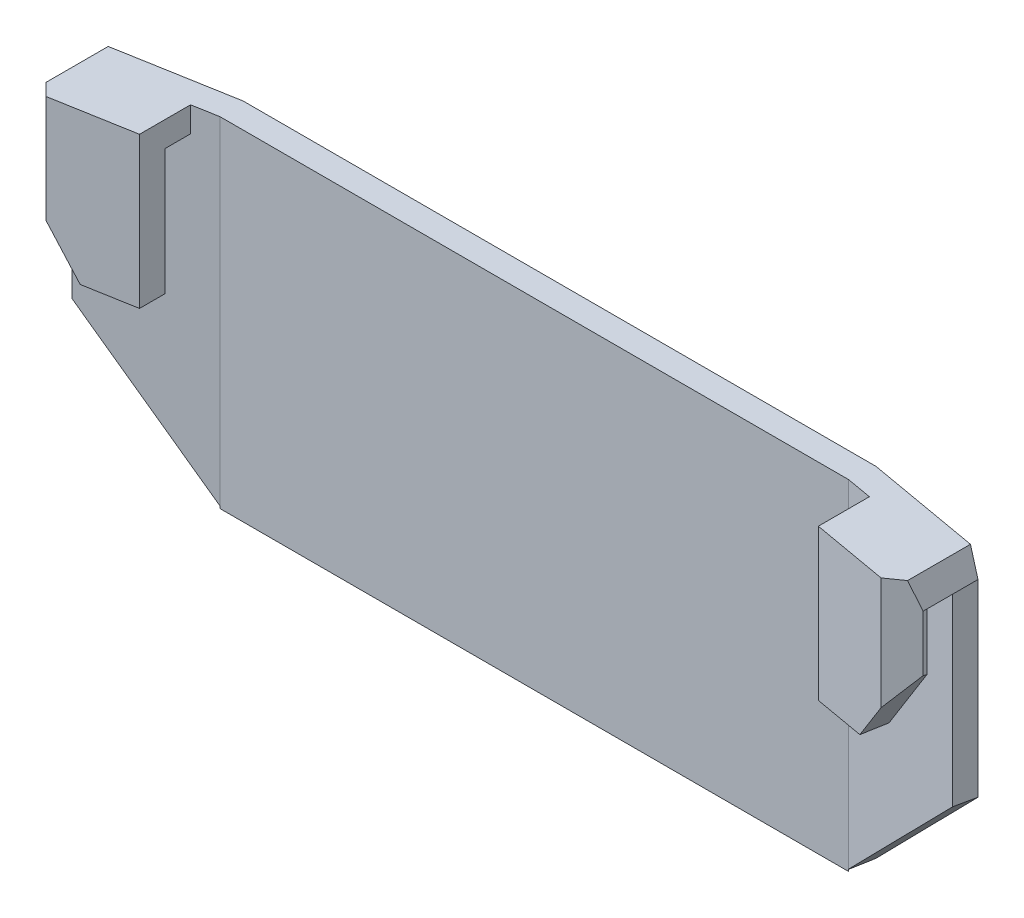
ISO-10303-21;
HEADER;
FILE_DESCRIPTION(('STEP AP214'),'2;1');
FILE_NAME('part.step','',(''),(''),'','','');
FILE_SCHEMA(('AUTOMOTIVE_DESIGN { 1 0 10303 214 1 1 1 1 }'));
ENDSEC;
DATA;
#1=APPLICATION_CONTEXT('core data for automotive mechanical design processes');
#2=APPLICATION_PROTOCOL_DEFINITION('international standard','automotive_design',2000,#1);
#3=PRODUCT_CONTEXT('',#1,'mechanical');
#4=PRODUCT('Part','Part','',(#3));
#5=PRODUCT_RELATED_PRODUCT_CATEGORY('part','',(#4));
#6=PRODUCT_DEFINITION_FORMATION('','',#4);
#7=PRODUCT_DEFINITION_CONTEXT('part definition',#1,'design');
#8=PRODUCT_DEFINITION('design','',#6,#7);
#9=PRODUCT_DEFINITION_SHAPE('','',#8);
#10=(LENGTH_UNIT() NAMED_UNIT(*) SI_UNIT(.MILLI.,.METRE.));
#11=(NAMED_UNIT(*) PLANE_ANGLE_UNIT() SI_UNIT($,.RADIAN.));
#12=(NAMED_UNIT(*) SI_UNIT($,.STERADIAN.) SOLID_ANGLE_UNIT());
#13=UNCERTAINTY_MEASURE_WITH_UNIT(LENGTH_MEASURE(1.E-05),#10,'distance_accuracy_value','');
#14=(GEOMETRIC_REPRESENTATION_CONTEXT(3) GLOBAL_UNCERTAINTY_ASSIGNED_CONTEXT((#13)) GLOBAL_UNIT_ASSIGNED_CONTEXT((#10,
#11,#12)) REPRESENTATION_CONTEXT('',''));
#15=CARTESIAN_POINT('',(0.,0.,0.));
#16=DIRECTION('',(0.,0.,1.));
#17=DIRECTION('',(1.,0.,0.));
#18=AXIS2_PLACEMENT_3D('',#15,#16,#17);
#19=CARTESIAN_POINT('',(35.0230548571713,2.,1.73648177667474));
#20=DIRECTION('',(-1.,0.,0.));
#21=DIRECTION('',(0.,0.,1.));
#22=AXIS2_PLACEMENT_3D('',#19,#20,#21);
#23=PLANE('',#22);
#24=DIRECTION('',(0.,-1.,0.));
#25=VECTOR('',#24,1.);
#26=CARTESIAN_POINT('',(35.0230548571713,2.,1.73648177667474));
#27=LINE('',#26,#25);
#28=CARTESIAN_POINT('',(35.0230548571713,0.,1.73648177667474));
#29=VERTEX_POINT('',#28);
#30=CARTESIAN_POINT('',(35.0230548571713,-15.0000000000022,1.73648177667474));
#31=VERTEX_POINT('',#30);
#32=EDGE_CURVE('E292',#29,#31,#27,.T.);
#33=ORIENTED_EDGE('',*,*,#32,.F.);
#34=DIRECTION('',(0.,0.,1.));
#35=VECTOR('',#34,1.);
#36=CARTESIAN_POINT('',(35.0230548571713,0.,7.82904144799773));
#37=LINE('',#36,#35);
#38=CARTESIAN_POINT('',(35.0230548571713,0.,3.76733500045552));
#39=VERTEX_POINT('',#38);
#40=EDGE_CURVE('E408',#29,#39,#37,.T.);
#41=ORIENTED_EDGE('',*,*,#40,.T.);
#42=DIRECTION('',(0.,1.,0.));
#43=VECTOR('',#42,1.);
#44=CARTESIAN_POINT('',(35.0230548571713,-25.,3.76733500045552));
#45=LINE('',#44,#43);
#46=CARTESIAN_POINT('',(35.0230548571713,-14.6473460385825,3.76733500045552));
#47=VERTEX_POINT('',#46);
#48=EDGE_CURVE('E295',#47,#39,#45,.T.);
#49=ORIENTED_EDGE('',*,*,#48,.F.);
#50=DIRECTION('',(0.,-0.171087869746592,-0.985255774317295));
#51=VECTOR('',#50,1.);
#52=CARTESIAN_POINT('',(35.0230548571713,-14.5023919940369,4.60209207359419));
#53=LINE('',#52,#51);
#54=EDGE_CURVE('E453',#47,#31,#53,.T.);
#55=ORIENTED_EDGE('',*,*,#54,.T.);
#56=EDGE_LOOP('',(#33,#41,#49,#55));
#57=FACE_BOUND('',#56,.T.);
#58=ADVANCED_FACE('F46',(#57),#23,.F.);
#59=CARTESIAN_POINT('',(-35.0230548571713,2.,1.73648177667474));
#60=DIRECTION('',(1.,0.,0.));
#61=DIRECTION('',(0.,0.,-1.));
#62=AXIS2_PLACEMENT_3D('',#59,#60,#61);
#63=PLANE('',#62);
#64=DIRECTION('',(0.,0.247800549739222,0.968811069068133));
#65=VECTOR('',#64,1.);
#66=CARTESIAN_POINT('',(-35.0230548571713,-5.09422179593814,3.55102758145829));
#67=LINE('',#66,#65);
#68=CARTESIAN_POINT('',(-35.0230548571713,-4.51944755934131,5.79818822422603));
#69=VERTEX_POINT('',#68);
#70=CARTESIAN_POINT('',(-35.0230548571713,-4.51155598372254,5.82904144799774));
#71=VERTEX_POINT('',#70);
#72=EDGE_CURVE('E522',#69,#71,#67,.T.);
#73=ORIENTED_EDGE('',*,*,#72,.T.);
#74=DIRECTION('',(0.,1.,0.));
#75=VECTOR('',#74,1.);
#76=CARTESIAN_POINT('',(-35.0230548571713,2.,5.82904144799774));
#77=LINE('',#76,#75);
#78=CARTESIAN_POINT('',(-35.0230548571713,0.,5.82904144799774));
#79=VERTEX_POINT('',#78);
#80=EDGE_CURVE('E418',#71,#79,#77,.T.);
#81=ORIENTED_EDGE('',*,*,#80,.T.);
#82=DIRECTION('',(0.,0.,-1.));
#83=VECTOR('',#82,1.);
#84=CARTESIAN_POINT('',(-35.0230548571713,0.,1.73648177667474));
#85=LINE('',#84,#83);
#86=CARTESIAN_POINT('',(-35.0230548571713,0.,5.79818822422603));
#87=VERTEX_POINT('',#86);
#88=EDGE_CURVE('E395',#79,#87,#85,.T.);
#89=ORIENTED_EDGE('',*,*,#88,.T.);
#90=DIRECTION('',(0.,1.,0.));
#91=VECTOR('',#90,1.);
#92=CARTESIAN_POINT('',(-35.0230548571713,-10.,5.79818822422603));
#93=LINE('',#92,#91);
#94=EDGE_CURVE('E271',#69,#87,#93,.T.);
#95=ORIENTED_EDGE('',*,*,#94,.F.);
#96=EDGE_LOOP('',(#73,#81,#89,#95));
#97=FACE_BOUND('',#96,.T.);
#98=ADVANCED_FACE('F597',(#97),#63,.F.);
#99=CARTESIAN_POINT('',(0.,0.,0.));
#100=DIRECTION('',(0.,1.,0.));
#101=DIRECTION('',(0.,0.,1.));
#102=AXIS2_PLACEMENT_3D('',#99,#100,#101);
#103=PLANE('',#102);
#104=DIRECTION('',(0.984807753012105,0.,0.173648177667512));
#105=VECTOR('',#104,1.);
#106=CARTESIAN_POINT('',(35.0230548571713,0.,5.79818822422602));
#107=LINE('',#106,#105);
#108=CARTESIAN_POINT('',(26.9999999999979,0.,4.38350718519735));
#109=VERTEX_POINT('',#108);
#110=CARTESIAN_POINT('',(35.0230548571713,0.,5.79818822422602));
#111=VERTEX_POINT('',#110);
#112=EDGE_CURVE('E244',#109,#111,#107,.T.);
#113=ORIENTED_EDGE('',*,*,#112,.F.);
#114=DIRECTION('',(0.,0.,1.));
#115=VECTOR('',#114,1.);
#116=CARTESIAN_POINT('',(26.9999999999979,0.,6.41436040896905));
#117=LINE('',#116,#115);
#118=CARTESIAN_POINT('',(26.9999999999979,0.,2.35265396142685));
#119=VERTEX_POINT('',#118);
#120=EDGE_CURVE('E304',#119,#109,#117,.T.);
#121=ORIENTED_EDGE('',*,*,#120,.F.);
#122=DIRECTION('',(-0.984807753012106,0.,-0.173648177667512));
#123=VECTOR('',#122,1.);
#124=CARTESIAN_POINT('',(24.9999999999987,0.,2.00000000000886));
#125=LINE('',#124,#123);
#126=EDGE_CURVE('E275',#39,#119,#125,.T.);
#127=ORIENTED_EDGE('',*,*,#126,.F.);
#128=DIRECTION('',(0.,0.,-1.));
#129=VECTOR('',#128,1.);
#130=CARTESIAN_POINT('',(35.0230548571713,0.,1.73648177667474));
#131=LINE('',#130,#129);
#132=EDGE_CURVE('E299',#111,#39,#131,.T.);
#133=ORIENTED_EDGE('',*,*,#132,.F.);
#134=EDGE_LOOP('',(#113,#121,#127,#133));
#135=FACE_BOUND('',#134,.T.);
#136=ADVANCED_FACE('F460',(#135),#103,.F.);
#137=DIRECTION('',(0.984807753012105,0.,-0.173648177667513));
#138=VECTOR('',#137,1.);
#139=CARTESIAN_POINT('',(-35.0230548571713,0.,5.79818822422603));
#140=LINE('',#139,#138);
#141=CARTESIAN_POINT('',(-26.9999999999979,0.,4.38350718519735));
#142=VERTEX_POINT('',#141);
#143=EDGE_CURVE('E249',#87,#142,#140,.T.);
#144=ORIENTED_EDGE('',*,*,#143,.F.);
#145=DIRECTION('',(0.,0.,1.));
#146=VECTOR('',#145,1.);
#147=CARTESIAN_POINT('',(-35.0230548571713,0.,1.73648177667474));
#148=LINE('',#147,#146);
#149=CARTESIAN_POINT('',(-35.0230548571713,0.,3.76733500045553));
#150=VERTEX_POINT('',#149);
#151=EDGE_CURVE('E337',#150,#87,#148,.T.);
#152=ORIENTED_EDGE('',*,*,#151,.F.);
#153=DIRECTION('',(-0.984807753012105,0.,0.173648177667513));
#154=VECTOR('',#153,1.);
#155=CARTESIAN_POINT('',(-26.9999999999979,0.,2.35265396142685));
#156=LINE('',#155,#154);
#157=CARTESIAN_POINT('',(-26.9999999999979,0.,2.35265396142685));
#158=VERTEX_POINT('',#157);
#159=EDGE_CURVE('E287',#158,#150,#156,.T.);
#160=ORIENTED_EDGE('',*,*,#159,.F.);
#161=DIRECTION('',(0.,0.,-1.));
#162=VECTOR('',#161,1.);
#163=CARTESIAN_POINT('',(-26.9999999999979,0.,6.41436040896905));
#164=LINE('',#163,#162);
#165=EDGE_CURVE('E341',#142,#158,#164,.T.);
#166=ORIENTED_EDGE('',*,*,#165,.F.);
#167=EDGE_LOOP('',(#144,#152,#160,#166));
#168=FACE_BOUND('',#167,.T.);
#169=ADVANCED_FACE('F564',(#168),#103,.F.);
#170=DIRECTION('',(0.,0.,1.));
#171=VECTOR('',#170,1.);
#172=CARTESIAN_POINT('',(35.0230548571713,0.,7.82904144799773));
#173=LINE('',#172,#171);
#174=CARTESIAN_POINT('',(35.0230548571713,0.,6.10260546797156));
#175=VERTEX_POINT('',#174);
#176=EDGE_CURVE('E404',#111,#175,#173,.T.);
#177=ORIENTED_EDGE('',*,*,#176,.T.);
#178=DIRECTION('',(0.,-1.,0.));
#179=VECTOR('',#178,1.);
#180=CARTESIAN_POINT('',(35.0230548571713,2.,6.10260546797156));
#181=LINE('',#180,#179);
#182=CARTESIAN_POINT('',(35.0230548571713,-4.44158432804816,6.10260546797155));
#183=VERTEX_POINT('',#182);
#184=EDGE_CURVE('E430',#175,#183,#181,.T.);
#185=ORIENTED_EDGE('',*,*,#184,.T.);
#186=DIRECTION('',(0.,-0.247800549739221,-0.968811069068133));
#187=VECTOR('',#186,1.);
#188=CARTESIAN_POINT('',(35.0230548571713,-5.09422179593816,3.55102758145828));
#189=LINE('',#188,#187);
#190=CARTESIAN_POINT('',(35.0230548571713,-4.51944755934134,5.79818822422602));
#191=VERTEX_POINT('',#190);
#192=EDGE_CURVE('E237',#183,#191,#189,.T.);
#193=ORIENTED_EDGE('',*,*,#192,.T.);
#194=DIRECTION('',(0.,1.,0.));
#195=VECTOR('',#194,1.);
#196=CARTESIAN_POINT('',(35.0230548571713,-10.,5.79818822422602));
#197=LINE('',#196,#195);
#198=EDGE_CURVE('E235',#191,#111,#197,.T.);
#199=ORIENTED_EDGE('',*,*,#198,.T.);
#200=EDGE_LOOP('',(#177,#185,#193,#199));
#201=FACE_BOUND('',#200,.T.);
#202=ADVANCED_FACE('F450',(#201),#23,.F.);
#203=CARTESIAN_POINT('',(35.0230548571713,2.,1.73648177667474));
#204=DIRECTION('',(-0.173648177667512,0.,0.984807753012105));
#205=DIRECTION('',(0.984807753012106,0.,0.173648177667512));
#206=AXIS2_PLACEMENT_3D('',#203,#204,#205);
#207=PLANE('',#206);
#208=DIRECTION('',(-0.984807753012105,0.,-0.173648177667512));
#209=VECTOR('',#208,1.);
#210=CARTESIAN_POINT('',(35.0230548571713,2.,1.73648177667474));
#211=LINE('',#210,#209);
#212=CARTESIAN_POINT('',(34.2951143886389,2.,1.60812623172247));
#213=VERTEX_POINT('',#212);
#214=CARTESIAN_POINT('',(25.1749773270525,2.,0.));
#215=VERTEX_POINT('',#214);
#216=EDGE_CURVE('E300',#213,#215,#211,.T.);
#217=ORIENTED_EDGE('',*,*,#216,.F.);
#218=DIRECTION('',(0.341399874534357,-0.937988446287796,0.0601980090910998));
#219=VECTOR('',#218,1.);
#220=CARTESIAN_POINT('',(34.2620648332325,2.09080290720218,1.60229870340387));
#221=LINE('',#220,#219);
#222=EDGE_CURVE('E401',#213,#29,#221,.T.);
#223=ORIENTED_EDGE('',*,*,#222,.T.);
#224=ORIENTED_EDGE('',*,*,#32,.T.);
#225=DIRECTION('',(0.696364240319945,0.707106781186549,0.122787803969384));
#226=VECTOR('',#225,1.);
#227=CARTESIAN_POINT('',(25.1749773270525,-25.,0.));
#228=LINE('',#227,#226);
#229=CARTESIAN_POINT('',(25.1749773270525,-25.,0.));
#230=VERTEX_POINT('',#229);
#231=EDGE_CURVE('E496',#230,#31,#228,.T.);
#232=ORIENTED_EDGE('',*,*,#231,.F.);
#233=DIRECTION('',(0.,-1.,0.));
#234=VECTOR('',#233,1.);
#235=CARTESIAN_POINT('',(25.1749773270525,2.,0.));
#236=LINE('',#235,#234);
#237=EDGE_CURVE('E376',#215,#230,#236,.T.);
#238=ORIENTED_EDGE('',*,*,#237,.F.);
#239=EDGE_LOOP('',(#217,#223,#224,#232,#238));
#240=FACE_BOUND('',#239,.T.);
#241=ADVANCED_FACE('F632',(#240),#207,.F.);
#242=CARTESIAN_POINT('',(25.1749773270525,2.,0.));
#243=DIRECTION('',(0.,0.,1.));
#244=DIRECTION('',(1.,0.,0.));
#245=AXIS2_PLACEMENT_3D('',#242,#243,#244);
#246=PLANE('',#245);
#247=ORIENTED_EDGE('',*,*,#237,.T.);
#248=DIRECTION('',(1.,0.,0.));
#249=VECTOR('',#248,1.);
#250=CARTESIAN_POINT('',(25.1749773270525,-25.,0.));
#251=LINE('',#250,#249);
#252=CARTESIAN_POINT('',(-25.1749773270525,-25.,0.));
#253=VERTEX_POINT('',#252);
#254=EDGE_CURVE('E276',#253,#230,#251,.T.);
#255=ORIENTED_EDGE('',*,*,#254,.F.);
#256=DIRECTION('',(0.,-1.,0.));
#257=VECTOR('',#256,1.);
#258=CARTESIAN_POINT('',(-25.1749773270525,2.,0.));
#259=LINE('',#258,#257);
#260=CARTESIAN_POINT('',(-25.1749773270525,2.,0.));
#261=VERTEX_POINT('',#260);
#262=EDGE_CURVE('E372',#261,#253,#259,.T.);
#263=ORIENTED_EDGE('',*,*,#262,.F.);
#264=DIRECTION('',(-1.,0.,0.));
#265=VECTOR('',#264,1.);
#266=CARTESIAN_POINT('',(25.1749773270525,2.,0.));
#267=LINE('',#266,#265);
#268=EDGE_CURVE('E303',#215,#261,#267,.T.);
#269=ORIENTED_EDGE('',*,*,#268,.F.);
#270=EDGE_LOOP('',(#247,#255,#263,#269));
#271=FACE_BOUND('',#270,.T.);
#272=ADVANCED_FACE('F637',(#271),#246,.F.);
#273=CARTESIAN_POINT('',(-25.1749773270525,2.,0.));
#274=DIRECTION('',(0.173648177667513,0.,0.984807753012105));
#275=DIRECTION('',(0.984807753012105,0.,-0.173648177667513));
#276=AXIS2_PLACEMENT_3D('',#273,#274,#275);
#277=PLANE('',#276);
#278=DIRECTION('',(0.,-1.,0.));
#279=VECTOR('',#278,1.);
#280=CARTESIAN_POINT('',(-35.0230548571713,2.,1.73648177667474));
#281=LINE('',#280,#279);
#282=CARTESIAN_POINT('',(-35.0230548571713,0.,1.73648177667474));
#283=VERTEX_POINT('',#282);
#284=CARTESIAN_POINT('',(-35.0230548571714,-15.0000000000023,1.73648177667474));
#285=VERTEX_POINT('',#284);
#286=EDGE_CURVE('E369',#283,#285,#281,.T.);
#287=ORIENTED_EDGE('',*,*,#286,.F.);
#288=DIRECTION('',(0.341399874534357,0.937988446287796,-0.0601980090911002));
#289=VECTOR('',#288,1.);
#290=CARTESIAN_POINT('',(-34.2620648332325,2.09080290720219,1.60229870340388));
#291=LINE('',#290,#289);
#292=CARTESIAN_POINT('',(-34.2951143886389,2.,1.60812623172247));
#293=VERTEX_POINT('',#292);
#294=EDGE_CURVE('E398',#283,#293,#291,.T.);
#295=ORIENTED_EDGE('',*,*,#294,.T.);
#296=DIRECTION('',(-0.984807753012105,0.,0.173648177667513));
#297=VECTOR('',#296,1.);
#298=CARTESIAN_POINT('',(-25.1749773270525,2.,0.));
#299=LINE('',#298,#297);
#300=EDGE_CURVE('E307',#261,#293,#299,.T.);
#301=ORIENTED_EDGE('',*,*,#300,.F.);
#302=ORIENTED_EDGE('',*,*,#262,.T.);
#303=DIRECTION('',(0.69636424031995,-0.707106781186544,-0.122787803969385));
#304=VECTOR('',#303,1.);
#305=CARTESIAN_POINT('',(-25.1749773270525,-25.,0.));
#306=LINE('',#305,#304);
#307=EDGE_CURVE('E519',#285,#253,#306,.T.);
#308=ORIENTED_EDGE('',*,*,#307,.F.);
#309=EDGE_LOOP('',(#287,#295,#301,#302,#308));
#310=FACE_BOUND('',#309,.T.);
#311=ADVANCED_FACE('F571',(#310),#277,.F.);
#312=DIRECTION('',(0.,1.,0.));
#313=VECTOR('',#312,1.);
#314=CARTESIAN_POINT('',(-35.0230548571713,-25.,3.76733500045553));
#315=LINE('',#314,#313);
#316=CARTESIAN_POINT('',(-35.0230548571714,-14.6473460385826,3.76733500045553));
#317=VERTEX_POINT('',#316);
#318=EDGE_CURVE('E284',#317,#150,#315,.T.);
#319=ORIENTED_EDGE('',*,*,#318,.T.);
#320=DIRECTION('',(0.,0.,-1.));
#321=VECTOR('',#320,1.);
#322=CARTESIAN_POINT('',(-35.0230548571713,0.,1.73648177667474));
#323=LINE('',#322,#321);
#324=EDGE_CURVE('E392',#150,#283,#323,.T.);
#325=ORIENTED_EDGE('',*,*,#324,.T.);
#326=ORIENTED_EDGE('',*,*,#286,.T.);
#327=DIRECTION('',(0.,0.171087869746591,0.985255774317295));
#328=VECTOR('',#327,1.);
#329=CARTESIAN_POINT('',(-35.0230548571713,-14.502391994037,4.6020920735942));
#330=LINE('',#329,#328);
#331=EDGE_CURVE('E501',#285,#317,#330,.T.);
#332=ORIENTED_EDGE('',*,*,#331,.T.);
#333=EDGE_LOOP('',(#319,#325,#326,#332));
#334=FACE_BOUND('',#333,.T.);
#335=ADVANCED_FACE('F553',(#334),#63,.F.);
#336=CARTESIAN_POINT('',(-35.0230548571713,2.,7.82904144799773));
#337=DIRECTION('',(-0.173648177667513,0.,-0.984807753012105));
#338=DIRECTION('',(-0.984807753012105,0.,0.173648177667513));
#339=AXIS2_PLACEMENT_3D('',#336,#337,#338);
#340=PLANE('',#339);
#341=DIRECTION('',(0.984807753012105,0.,-0.173648177667513));
#342=VECTOR('',#341,1.);
#343=CARTESIAN_POINT('',(-35.0230548571713,2.,7.82904144799773));
#344=LINE('',#343,#342);
#345=CARTESIAN_POINT('',(-33.3228473189625,2.,7.52924898620656));
#346=VERTEX_POINT('',#345);
#347=CARTESIAN_POINT('',(-26.9999999999979,2.,6.41436040896905));
#348=VERTEX_POINT('',#347);
#349=EDGE_CURVE('E311',#346,#348,#344,.T.);
#350=ORIENTED_EDGE('',*,*,#349,.F.);
#351=DIRECTION('',(0.,-1.,0.));
#352=VECTOR('',#351,1.);
#353=CARTESIAN_POINT('',(-33.3228473189625,2.,7.52924898620656));
#354=LINE('',#353,#352);
#355=CARTESIAN_POINT('',(-33.3228473189625,-6.54298279417393,7.52924898620657));
#356=VERTEX_POINT('',#355);
#357=EDGE_CURVE('E411',#346,#356,#354,.T.);
#358=ORIENTED_EDGE('',*,*,#357,.T.);
#359=DIRECTION('',(-0.553155331909906,0.827348697109293,0.0975362095387999));
#360=VECTOR('',#359,1.);
#361=CARTESIAN_POINT('',(-31.0115274285846,-10.,7.12170092848339));
#362=LINE('',#361,#360);
#363=CARTESIAN_POINT('',(-31.0115274285846,-10.,7.12170092848339));
#364=VERTEX_POINT('',#363);
#365=EDGE_CURVE('E535',#364,#356,#362,.T.);
#366=ORIENTED_EDGE('',*,*,#365,.F.);
#367=DIRECTION('',(-0.984807753012105,0.,0.173648177667513));
#368=VECTOR('',#367,1.);
#369=CARTESIAN_POINT('',(-35.0230548571713,-10.,7.82904144799773));
#370=LINE('',#369,#368);
#371=CARTESIAN_POINT('',(-26.9999999999979,-10.,6.41436040896905));
#372=VERTEX_POINT('',#371);
#373=EDGE_CURVE('E261',#372,#364,#370,.T.);
#374=ORIENTED_EDGE('',*,*,#373,.F.);
#375=DIRECTION('',(0.,-1.,0.));
#376=VECTOR('',#375,1.);
#377=CARTESIAN_POINT('',(-26.9999999999979,2.,6.41436040896905));
#378=LINE('',#377,#376);
#379=EDGE_CURVE('E366',#348,#372,#378,.T.);
#380=ORIENTED_EDGE('',*,*,#379,.F.);
#381=EDGE_LOOP('',(#350,#358,#366,#374,#380));
#382=FACE_BOUND('',#381,.T.);
#383=ADVANCED_FACE('F605',(#382),#340,.F.);
#384=CARTESIAN_POINT('',(-26.9999999999979,2.,6.41436040896905));
#385=DIRECTION('',(-1.,0.,0.));
#386=DIRECTION('',(0.,0.,1.));
#387=AXIS2_PLACEMENT_3D('',#384,#385,#386);
#388=PLANE('',#387);
#389=ORIENTED_EDGE('',*,*,#379,.T.);
#390=DIRECTION('',(0.,0.,1.));
#391=VECTOR('',#390,1.);
#392=CARTESIAN_POINT('',(-26.9999999999979,-10.,4.38350718519735));
#393=LINE('',#392,#391);
#394=CARTESIAN_POINT('',(-26.9999999999979,-10.,4.38350718519735));
#395=VERTEX_POINT('',#394);
#396=EDGE_CURVE('E257',#395,#372,#393,.T.);
#397=ORIENTED_EDGE('',*,*,#396,.F.);
#398=DIRECTION('',(0.,1.,0.));
#399=VECTOR('',#398,1.);
#400=CARTESIAN_POINT('',(-26.9999999999979,-10.,4.38350718519735));
#401=LINE('',#400,#399);
#402=EDGE_CURVE('E265',#395,#142,#401,.T.);
#403=ORIENTED_EDGE('',*,*,#402,.T.);
#404=ORIENTED_EDGE('',*,*,#165,.T.);
#405=DIRECTION('',(0.,-1.,0.));
#406=VECTOR('',#405,1.);
#407=CARTESIAN_POINT('',(-26.9999999999979,2.,2.35265396142685));
#408=LINE('',#407,#406);
#409=CARTESIAN_POINT('',(-26.9999999999979,2.,2.35265396142685));
#410=VERTEX_POINT('',#409);
#411=EDGE_CURVE('E362',#410,#158,#408,.T.);
#412=ORIENTED_EDGE('',*,*,#411,.F.);
#413=DIRECTION('',(0.,0.,-1.));
#414=VECTOR('',#413,1.);
#415=CARTESIAN_POINT('',(-26.9999999999979,2.,6.41436040896905));
#416=LINE('',#415,#414);
#417=EDGE_CURVE('E314',#348,#410,#416,.T.);
#418=ORIENTED_EDGE('',*,*,#417,.F.);
#419=EDGE_LOOP('',(#389,#397,#403,#404,#412,#418));
#420=FACE_BOUND('',#419,.T.);
#421=ADVANCED_FACE('F588',(#420),#388,.F.);
#422=CARTESIAN_POINT('',(-26.9999999999979,2.,2.35265396142685));
#423=DIRECTION('',(-0.173648177667513,0.,-0.984807753012105));
#424=DIRECTION('',(-0.984807753012105,0.,0.173648177667513));
#425=AXIS2_PLACEMENT_3D('',#422,#423,#424);
#426=PLANE('',#425);
#427=ORIENTED_EDGE('',*,*,#318,.F.);
#428=DIRECTION('',(-0.69636424031995,0.707106781186544,0.122787803969386));
#429=VECTOR('',#428,1.);
#430=CARTESIAN_POINT('',(-24.8276809717159,-25.,1.96961550603303));
#431=LINE('',#430,#429);
#432=CARTESIAN_POINT('',(-24.9999999999987,-24.8250226729473,2.00000000000886));
#433=VERTEX_POINT('',#432);
#434=EDGE_CURVE('E518',#433,#317,#431,.T.);
#435=ORIENTED_EDGE('',*,*,#434,.F.);
#436=DIRECTION('',(0.,-1.,0.));
#437=VECTOR('',#436,1.);
#438=CARTESIAN_POINT('',(-24.9999999999987,2.,2.00000000000885));
#439=LINE('',#438,#437);
#440=CARTESIAN_POINT('',(-24.9999999999987,2.,2.00000000000885));
#441=VERTEX_POINT('',#440);
#442=EDGE_CURVE('E358',#441,#433,#439,.T.);
#443=ORIENTED_EDGE('',*,*,#442,.F.);
#444=DIRECTION('',(0.984807753012105,0.,-0.173648177667513));
#445=VECTOR('',#444,1.);
#446=CARTESIAN_POINT('',(-26.9999999999979,2.,2.35265396142685));
#447=LINE('',#446,#445);
#448=EDGE_CURVE('E317',#410,#441,#447,.T.);
#449=ORIENTED_EDGE('',*,*,#448,.F.);
#450=ORIENTED_EDGE('',*,*,#411,.T.);
#451=ORIENTED_EDGE('',*,*,#159,.T.);
#452=EDGE_LOOP('',(#427,#435,#443,#449,#450,#451));
#453=FACE_BOUND('',#452,.T.);
#454=ADVANCED_FACE('F555',(#453),#426,.F.);
#455=CARTESIAN_POINT('',(-24.9999999999987,2.,2.00000000000885));
#456=DIRECTION('',(0.,0.,-1.));
#457=DIRECTION('',(-1.,0.,0.));
#458=AXIS2_PLACEMENT_3D('',#455,#456,#457);
#459=PLANE('',#458);
#460=ORIENTED_EDGE('',*,*,#442,.T.);
#461=DIRECTION('',(0.,1.,0.));
#462=VECTOR('',#461,1.);
#463=CARTESIAN_POINT('',(-24.9999999999987,2.,2.00000000000885));
#464=LINE('',#463,#462);
#465=CARTESIAN_POINT('',(-24.9999999999988,-25.,2.00000000000887));
#466=VERTEX_POINT('',#465);
#467=EDGE_CURVE('E505',#466,#433,#464,.T.);
#468=ORIENTED_EDGE('',*,*,#467,.F.);
#469=DIRECTION('',(-1.,0.,0.));
#470=VECTOR('',#469,1.);
#471=CARTESIAN_POINT('',(-24.9999999999987,-25.,2.00000000000885));
#472=LINE('',#471,#470);
#473=CARTESIAN_POINT('',(24.9999999999987,-25.,2.00000000000886));
#474=VERTEX_POINT('',#473);
#475=EDGE_CURVE('E280',#474,#466,#472,.T.);
#476=ORIENTED_EDGE('',*,*,#475,.F.);
#477=DIRECTION('',(0.,-1.,0.));
#478=VECTOR('',#477,1.);
#479=CARTESIAN_POINT('',(24.9999999999987,2.,2.00000000000886));
#480=LINE('',#479,#478);
#481=CARTESIAN_POINT('',(24.9999999999987,-24.8250226729473,2.00000000000886));
#482=VERTEX_POINT('',#481);
#483=EDGE_CURVE('E478',#482,#474,#480,.T.);
#484=ORIENTED_EDGE('',*,*,#483,.F.);
#485=DIRECTION('',(0.,-1.,0.));
#486=VECTOR('',#485,1.);
#487=CARTESIAN_POINT('',(24.9999999999987,2.,2.00000000000886));
#488=LINE('',#487,#486);
#489=CARTESIAN_POINT('',(24.9999999999987,2.,2.00000000000886));
#490=VERTEX_POINT('',#489);
#491=EDGE_CURVE('E354',#490,#482,#488,.T.);
#492=ORIENTED_EDGE('',*,*,#491,.F.);
#493=DIRECTION('',(1.,0.,0.));
#494=VECTOR('',#493,1.);
#495=CARTESIAN_POINT('',(-24.9999999999987,2.,2.00000000000885));
#496=LINE('',#495,#494);
#497=EDGE_CURVE('E320',#441,#490,#496,.T.);
#498=ORIENTED_EDGE('',*,*,#497,.F.);
#499=EDGE_LOOP('',(#460,#468,#476,#484,#492,#498));
#500=FACE_BOUND('',#499,.T.);
#501=ADVANCED_FACE('F582',(#500),#459,.F.);
#502=CARTESIAN_POINT('',(26.9999999999979,2.,2.35265396142685));
#503=DIRECTION('',(0.173648177667512,0.,-0.984807753012105));
#504=DIRECTION('',(-0.984807753012106,0.,-0.173648177667512));
#505=AXIS2_PLACEMENT_3D('',#502,#503,#504);
#506=PLANE('',#505);
#507=ORIENTED_EDGE('',*,*,#491,.T.);
#508=DIRECTION('',(-0.696364240319945,-0.707106781186549,-0.122787803969384));
#509=VECTOR('',#508,1.);
#510=CARTESIAN_POINT('',(24.8276809717159,-25.,1.96961550603303));
#511=LINE('',#510,#509);
#512=EDGE_CURVE('E472',#47,#482,#511,.T.);
#513=ORIENTED_EDGE('',*,*,#512,.F.);
#514=ORIENTED_EDGE('',*,*,#48,.T.);
#515=ORIENTED_EDGE('',*,*,#126,.T.);
#516=DIRECTION('',(0.,-1.,0.));
#517=VECTOR('',#516,1.);
#518=CARTESIAN_POINT('',(26.9999999999979,2.,2.35265396142685));
#519=LINE('',#518,#517);
#520=CARTESIAN_POINT('',(26.9999999999979,2.,2.35265396142685));
#521=VERTEX_POINT('',#520);
#522=EDGE_CURVE('E350',#521,#119,#519,.T.);
#523=ORIENTED_EDGE('',*,*,#522,.F.);
#524=DIRECTION('',(0.984807753012106,0.,0.173648177667512));
#525=VECTOR('',#524,1.);
#526=CARTESIAN_POINT('',(26.9999999999979,2.,2.35265396142685));
#527=LINE('',#526,#525);
#528=EDGE_CURVE('E323',#490,#521,#527,.T.);
#529=ORIENTED_EDGE('',*,*,#528,.F.);
#530=EDGE_LOOP('',(#507,#513,#514,#515,#523,#529));
#531=FACE_BOUND('',#530,.T.);
#532=ADVANCED_FACE('F469',(#531),#506,.F.);
#533=CARTESIAN_POINT('',(26.9999999999979,2.,6.41436040896905));
#534=DIRECTION('',(1.,0.,0.));
#535=DIRECTION('',(0.,0.,-1.));
#536=AXIS2_PLACEMENT_3D('',#533,#534,#535);
#537=PLANE('',#536);
#538=ORIENTED_EDGE('',*,*,#120,.T.);
#539=DIRECTION('',(0.,1.,0.));
#540=VECTOR('',#539,1.);
#541=CARTESIAN_POINT('',(26.9999999999979,-10.,4.38350718519735));
#542=LINE('',#541,#540);
#543=CARTESIAN_POINT('',(26.9999999999979,-10.,4.38350718519735));
#544=VERTEX_POINT('',#543);
#545=EDGE_CURVE('E452',#544,#109,#542,.T.);
#546=ORIENTED_EDGE('',*,*,#545,.F.);
#547=DIRECTION('',(0.,0.,-1.));
#548=VECTOR('',#547,1.);
#549=CARTESIAN_POINT('',(26.9999999999979,-10.,4.38350718519735));
#550=LINE('',#549,#548);
#551=CARTESIAN_POINT('',(26.9999999999979,-10.,6.41436040896905));
#552=VERTEX_POINT('',#551);
#553=EDGE_CURVE('E241',#552,#544,#550,.T.);
#554=ORIENTED_EDGE('',*,*,#553,.F.);
#555=DIRECTION('',(0.,-1.,0.));
#556=VECTOR('',#555,1.);
#557=CARTESIAN_POINT('',(26.9999999999979,2.,6.41436040896905));
#558=LINE('',#557,#556);
#559=CARTESIAN_POINT('',(26.9999999999979,2.,6.41436040896905));
#560=VERTEX_POINT('',#559);
#561=EDGE_CURVE('E333',#560,#552,#558,.T.);
#562=ORIENTED_EDGE('',*,*,#561,.F.);
#563=DIRECTION('',(0.,0.,1.));
#564=VECTOR('',#563,1.);
#565=CARTESIAN_POINT('',(26.9999999999979,2.,6.41436040896905));
#566=LINE('',#565,#564);
#567=EDGE_CURVE('E326',#521,#560,#566,.T.);
#568=ORIENTED_EDGE('',*,*,#567,.F.);
#569=ORIENTED_EDGE('',*,*,#522,.T.);
#570=EDGE_LOOP('',(#538,#546,#554,#562,#568,#569));
#571=FACE_BOUND('',#570,.T.);
#572=ADVANCED_FACE('F648',(#571),#537,.F.);
#573=CARTESIAN_POINT('',(35.0230548571713,2.,7.82904144799773));
#574=DIRECTION('',(0.173648177667512,0.,-0.984807753012105));
#575=DIRECTION('',(-0.984807753012106,0.,-0.173648177667512));
#576=AXIS2_PLACEMENT_3D('',#573,#574,#575);
#577=PLANE('',#576);
#578=DIRECTION('',(-0.553155331909906,-0.827348697109293,-0.0975362095387993));
#579=VECTOR('',#578,1.);
#580=CARTESIAN_POINT('',(31.0115274285846,-10.,7.1217009284834));
#581=LINE('',#580,#579);
#582=CARTESIAN_POINT('',(33.0534393511471,-6.94593349952706,7.48174509266271));
#583=VERTEX_POINT('',#582);
#584=CARTESIAN_POINT('',(31.0115274285846,-10.,7.12170092848339));
#585=VERTEX_POINT('',#584);
#586=EDGE_CURVE('E224',#583,#585,#581,.T.);
#587=ORIENTED_EDGE('',*,*,#586,.F.);
#588=DIRECTION('',(0.,1.,0.));
#589=VECTOR('',#588,1.);
#590=CARTESIAN_POINT('',(33.0534393511471,2.,7.4817450926627));
#591=LINE('',#590,#589);
#592=CARTESIAN_POINT('',(33.0534393511471,2.,7.4817450926627));
#593=VERTEX_POINT('',#592);
#594=EDGE_CURVE('E56',#583,#593,#591,.T.);
#595=ORIENTED_EDGE('',*,*,#594,.T.);
#596=DIRECTION('',(0.984807753012105,0.,0.173648177667512));
#597=VECTOR('',#596,1.);
#598=CARTESIAN_POINT('',(35.0230548571713,2.,7.82904144799773));
#599=LINE('',#598,#597);
#600=EDGE_CURVE('E329',#560,#593,#599,.T.);
#601=ORIENTED_EDGE('',*,*,#600,.F.);
#602=ORIENTED_EDGE('',*,*,#561,.T.);
#603=DIRECTION('',(-0.984807753012105,0.,-0.173648177667512));
#604=VECTOR('',#603,1.);
#605=CARTESIAN_POINT('',(26.9999999999979,-10.,6.41436040896905));
#606=LINE('',#605,#604);
#607=EDGE_CURVE('E245',#585,#552,#606,.T.);
#608=ORIENTED_EDGE('',*,*,#607,.F.);
#609=EDGE_LOOP('',(#587,#595,#601,#602,#608));
#610=FACE_BOUND('',#609,.T.);
#611=ADVANCED_FACE('F437',(#610),#577,.F.);
#612=CARTESIAN_POINT('',(0.,2.,0.));
#613=DIRECTION('',(0.,1.,0.));
#614=DIRECTION('',(0.,0.,1.));
#615=AXIS2_PLACEMENT_3D('',#612,#613,#614);
#616=PLANE('',#615);
#617=DIRECTION('',(0.,0.,1.));
#618=VECTOR('',#617,1.);
#619=CARTESIAN_POINT('',(-34.2951143886389,2.,7.82904144799773));
#620=LINE('',#619,#618);
#621=CARTESIAN_POINT('',(-34.2951143886389,2.,6.55698191653014));
#622=VERTEX_POINT('',#621);
#623=EDGE_CURVE('E388',#293,#622,#620,.T.);
#624=ORIENTED_EDGE('',*,*,#623,.T.);
#625=DIRECTION('',(-0.707106781186546,0.,-0.707106781186549));
#626=VECTOR('',#625,1.);
#627=CARTESIAN_POINT('',(-20.4260481525846,2.,20.4260481525845));
#628=LINE('',#627,#626);
#629=EDGE_CURVE('E427',#622,#346,#628,.F.);
#630=ORIENTED_EDGE('',*,*,#629,.T.);
#631=ORIENTED_EDGE('',*,*,#349,.T.);
#632=ORIENTED_EDGE('',*,*,#417,.T.);
#633=ORIENTED_EDGE('',*,*,#448,.T.);
#634=ORIENTED_EDGE('',*,*,#497,.T.);
#635=ORIENTED_EDGE('',*,*,#528,.T.);
#636=ORIENTED_EDGE('',*,*,#567,.T.);
#637=ORIENTED_EDGE('',*,*,#600,.T.);
#638=DIRECTION('',(-0.819152044289332,0.,0.57357643635056));
#639=VECTOR('',#638,1.);
#640=CARTESIAN_POINT('',(14.389518970499,2.,20.5503628357219));
#641=LINE('',#640,#639);
#642=CARTESIAN_POINT('',(34.2951143886389,2.,6.61231487140521));
#643=VERTEX_POINT('',#642);
#644=EDGE_CURVE('E424',#593,#643,#641,.F.);
#645=ORIENTED_EDGE('',*,*,#644,.T.);
#646=DIRECTION('',(0.,0.,-1.));
#647=VECTOR('',#646,1.);
#648=CARTESIAN_POINT('',(34.2951143886389,2.,1.73648177667474));
#649=LINE('',#648,#647);
#650=EDGE_CURVE('E385',#643,#213,#649,.T.);
#651=ORIENTED_EDGE('',*,*,#650,.T.);
#652=ORIENTED_EDGE('',*,*,#216,.T.);
#653=ORIENTED_EDGE('',*,*,#268,.T.);
#654=ORIENTED_EDGE('',*,*,#300,.T.);
#655=EDGE_LOOP('',(#624,#630,#631,#632,#633,#634,#635,#636,#637,#645,#651,#652,#653,#654));
#656=FACE_BOUND('',#655,.T.);
#657=ADVANCED_FACE('F440',(#656),#616,.T.);
#658=CARTESIAN_POINT('',(0.,-25.,0.));
#659=DIRECTION('',(0.,-1.,0.));
#660=DIRECTION('',(0.,0.,-1.));
#661=AXIS2_PLACEMENT_3D('',#658,#659,#660);
#662=PLANE('',#661);
#663=DIRECTION('',(-0.173648177667513,0.,-0.984807753012105));
#664=VECTOR('',#663,1.);
#665=CARTESIAN_POINT('',(-22.2853216813611,-25.,16.3880515283085));
#666=LINE('',#665,#664);
#667=CARTESIAN_POINT('',(-24.8276809717159,-25.,1.96961550603303));
#668=VERTEX_POINT('',#667);
#669=EDGE_CURVE('E514',#668,#253,#666,.T.);
#670=ORIENTED_EDGE('',*,*,#669,.T.);
#671=ORIENTED_EDGE('',*,*,#254,.T.);
#672=DIRECTION('',(0.173648177667512,0.,-0.984807753012105));
#673=VECTOR('',#672,1.);
#674=CARTESIAN_POINT('',(22.2853216813611,-25.,16.3880515283086));
#675=LINE('',#674,#673);
#676=CARTESIAN_POINT('',(24.8276809717159,-25.,1.96961550603303));
#677=VERTEX_POINT('',#676);
#678=EDGE_CURVE('E486',#677,#230,#675,.T.);
#679=ORIENTED_EDGE('',*,*,#678,.F.);
#680=DIRECTION('',(0.984807753012106,0.,0.173648177667512));
#681=VECTOR('',#680,1.);
#682=CARTESIAN_POINT('',(35.0230548571713,-25.,3.76733500045552));
#683=LINE('',#682,#681);
#684=EDGE_CURVE('E484',#677,#474,#683,.T.);
#685=ORIENTED_EDGE('',*,*,#684,.T.);
#686=ORIENTED_EDGE('',*,*,#475,.T.);
#687=DIRECTION('',(0.984807753012105,0.,-0.173648177667513));
#688=VECTOR('',#687,1.);
#689=CARTESIAN_POINT('',(-0.411822096852871,-25.,-2.33555917079045));
#690=LINE('',#689,#688);
#691=EDGE_CURVE('E291',#466,#668,#690,.T.);
#692=ORIENTED_EDGE('',*,*,#691,.T.);
#693=EDGE_LOOP('',(#670,#671,#679,#685,#686,#692));
#694=FACE_BOUND('',#693,.T.);
#695=ADVANCED_FACE('F576',(#694),#662,.T.);
#696=CARTESIAN_POINT('',(-35.0230548571713,-10.,5.79818822422603));
#697=DIRECTION('',(0.173648177667513,0.,0.984807753012105));
#698=DIRECTION('',(0.984807753012105,0.,-0.173648177667513));
#699=AXIS2_PLACEMENT_3D('',#696,#697,#698);
#700=PLANE('',#699);
#701=DIRECTION('',(0.984807753012105,0.,-0.173648177667513));
#702=VECTOR('',#701,1.);
#703=CARTESIAN_POINT('',(-35.0230548571713,-10.,5.79818822422603));
#704=LINE('',#703,#702);
#705=CARTESIAN_POINT('',(-31.3588237839196,-10.,5.15208542245918));
#706=VERTEX_POINT('',#705);
#707=EDGE_CURVE('E254',#706,#395,#704,.T.);
#708=ORIENTED_EDGE('',*,*,#707,.F.);
#709=DIRECTION('',(0.553155331909906,-0.827348697109293,-0.0975362095388));
#710=VECTOR('',#709,1.);
#711=CARTESIAN_POINT('',(-31.3588237839196,-10.,5.15208542245918));
#712=LINE('',#711,#710);
#713=EDGE_CURVE('E529',#69,#706,#712,.T.);
#714=ORIENTED_EDGE('',*,*,#713,.F.);
#715=ORIENTED_EDGE('',*,*,#94,.T.);
#716=ORIENTED_EDGE('',*,*,#143,.T.);
#717=ORIENTED_EDGE('',*,*,#402,.F.);
#718=EDGE_LOOP('',(#708,#714,#715,#716,#717));
#719=FACE_BOUND('',#718,.T.);
#720=ADVANCED_FACE('F593',(#719),#700,.F.);
#721=CARTESIAN_POINT('',(0.,-10.,0.));
#722=DIRECTION('',(0.,1.,0.));
#723=DIRECTION('',(0.,0.,1.));
#724=AXIS2_PLACEMENT_3D('',#721,#722,#723);
#725=PLANE('',#724);
#726=ORIENTED_EDGE('',*,*,#373,.T.);
#727=DIRECTION('',(0.173648177667513,0.,0.984807753012105));
#728=VECTOR('',#727,1.);
#729=CARTESIAN_POINT('',(-32.618134482837,-10.,-1.98982044953625));
#730=LINE('',#729,#728);
#731=EDGE_CURVE('E532',#706,#364,#730,.T.);
#732=ORIENTED_EDGE('',*,*,#731,.F.);
#733=ORIENTED_EDGE('',*,*,#707,.T.);
#734=ORIENTED_EDGE('',*,*,#396,.T.);
#735=EDGE_LOOP('',(#726,#732,#733,#734));
#736=FACE_BOUND('',#735,.T.);
#737=ADVANCED_FACE('F609',(#736),#725,.F.);
#738=CARTESIAN_POINT('',(35.0230548571713,-10.,5.79818822422602));
#739=DIRECTION('',(-0.173648177667512,0.,0.984807753012106));
#740=DIRECTION('',(0.984807753012106,0.,0.173648177667512));
#741=AXIS2_PLACEMENT_3D('',#738,#739,#740);
#742=PLANE('',#741);
#743=ORIENTED_EDGE('',*,*,#198,.F.);
#744=DIRECTION('',(0.553155331909906,0.827348697109293,0.0975362095387995));
#745=VECTOR('',#744,1.);
#746=CARTESIAN_POINT('',(31.3588237839196,-10.,5.15208542245918));
#747=LINE('',#746,#745);
#748=CARTESIAN_POINT('',(31.3588237839196,-10.,5.15208542245918));
#749=VERTEX_POINT('',#748);
#750=EDGE_CURVE('E222',#749,#191,#747,.T.);
#751=ORIENTED_EDGE('',*,*,#750,.F.);
#752=DIRECTION('',(0.984807753012105,0.,0.173648177667512));
#753=VECTOR('',#752,1.);
#754=CARTESIAN_POINT('',(35.0230548571713,-10.,5.79818822422602));
#755=LINE('',#754,#753);
#756=EDGE_CURVE('E233',#544,#749,#755,.T.);
#757=ORIENTED_EDGE('',*,*,#756,.F.);
#758=ORIENTED_EDGE('',*,*,#545,.T.);
#759=ORIENTED_EDGE('',*,*,#112,.T.);
#760=EDGE_LOOP('',(#743,#751,#757,#758,#759));
#761=FACE_BOUND('',#760,.T.);
#762=ADVANCED_FACE('F232',(#761),#742,.F.);
#763=CARTESIAN_POINT('',(0.,-10.,0.));
#764=DIRECTION('',(0.,1.,0.));
#765=DIRECTION('',(0.,0.,1.));
#766=AXIS2_PLACEMENT_3D('',#763,#764,#765);
#767=PLANE('',#766);
#768=ORIENTED_EDGE('',*,*,#756,.T.);
#769=DIRECTION('',(-0.173648177667512,0.,0.984807753012106));
#770=VECTOR('',#769,1.);
#771=CARTESIAN_POINT('',(32.618134482837,-10.,-1.98982044953625));
#772=LINE('',#771,#770);
#773=EDGE_CURVE('E219',#749,#585,#772,.T.);
#774=ORIENTED_EDGE('',*,*,#773,.T.);
#775=ORIENTED_EDGE('',*,*,#607,.T.);
#776=ORIENTED_EDGE('',*,*,#553,.T.);
#777=EDGE_LOOP('',(#768,#774,#775,#776));
#778=FACE_BOUND('',#777,.T.);
#779=ADVANCED_FACE('F239',(#778),#767,.F.);
#780=CARTESIAN_POINT('',(22.2853216813611,-25.,16.3880515283086));
#781=DIRECTION('',(-0.696364240319947,0.707106781186546,-0.122787803969384));
#782=DIRECTION('',(-0.712498293208705,-0.701673843159827,0.));
#783=AXIS2_PLACEMENT_3D('',#780,#781,#782);
#784=PLANE('',#783);
#785=ORIENTED_EDGE('',*,*,#512,.T.);
#786=EDGE_CURVE('E479',#482,#677,#511,.T.);
#787=ORIENTED_EDGE('',*,*,#786,.T.);
#788=ORIENTED_EDGE('',*,*,#678,.T.);
#789=ORIENTED_EDGE('',*,*,#231,.T.);
#790=ORIENTED_EDGE('',*,*,#54,.F.);
#791=EDGE_LOOP('',(#785,#787,#788,#789,#790));
#792=FACE_BOUND('',#791,.T.);
#793=ADVANCED_FACE('F494',(#792),#784,.F.);
#794=CARTESIAN_POINT('',(26.9999999999979,2.,2.35265396142685));
#795=DIRECTION('',(0.173648177667512,0.,-0.984807753012105));
#796=DIRECTION('',(-0.984807753012106,0.,-0.173648177667512));
#797=AXIS2_PLACEMENT_3D('',#794,#795,#796);
#798=PLANE('',#797);
#799=ORIENTED_EDGE('',*,*,#483,.T.);
#800=ORIENTED_EDGE('',*,*,#684,.F.);
#801=ORIENTED_EDGE('',*,*,#786,.F.);
#802=EDGE_LOOP('',(#799,#800,#801));
#803=FACE_BOUND('',#802,.T.);
#804=ADVANCED_FACE('F752',(#803),#798,.T.);
#805=CARTESIAN_POINT('',(-22.2853216813611,-25.,16.3880515283085));
#806=DIRECTION('',(0.696364240319943,0.707106781186551,-0.122787803969384));
#807=DIRECTION('',(-0.71249829320871,0.701673843159823,0.));
#808=AXIS2_PLACEMENT_3D('',#805,#806,#807);
#809=PLANE('',#808);
#810=ORIENTED_EDGE('',*,*,#307,.T.);
#811=ORIENTED_EDGE('',*,*,#669,.F.);
#812=EDGE_CURVE('E513',#668,#433,#431,.T.);
#813=ORIENTED_EDGE('',*,*,#812,.T.);
#814=ORIENTED_EDGE('',*,*,#434,.T.);
#815=ORIENTED_EDGE('',*,*,#331,.F.);
#816=EDGE_LOOP('',(#810,#811,#813,#814,#815));
#817=FACE_BOUND('',#816,.T.);
#818=ADVANCED_FACE('F546',(#817),#809,.F.);
#819=CARTESIAN_POINT('',(-26.9999999999979,2.,2.35265396142685));
#820=DIRECTION('',(-0.173648177667513,0.,-0.984807753012105));
#821=DIRECTION('',(-0.984807753012105,0.,0.173648177667513));
#822=AXIS2_PLACEMENT_3D('',#819,#820,#821);
#823=PLANE('',#822);
#824=ORIENTED_EDGE('',*,*,#467,.T.);
#825=ORIENTED_EDGE('',*,*,#812,.F.);
#826=ORIENTED_EDGE('',*,*,#691,.F.);
#827=EDGE_LOOP('',(#824,#825,#826));
#828=FACE_BOUND('',#827,.T.);
#829=ADVANCED_FACE('F580',(#828),#823,.T.);
#830=CARTESIAN_POINT('',(-32.618134482837,-10.,-1.98982044953625));
#831=DIRECTION('',(0.814779411357696,0.561688644527869,-0.14366759354862));
#832=DIRECTION('',(-0.567576684279783,0.823320537495554,0.));
#833=AXIS2_PLACEMENT_3D('',#830,#831,#832);
#834=PLANE('',#833);
#835=ORIENTED_EDGE('',*,*,#365,.T.);
#836=DIRECTION('',(0.540140335946646,-0.645365659891264,0.540140335946648));
#837=VECTOR('',#836,1.);
#838=CARTESIAN_POINT('',(-36.3008288131721,-2.98485749922392,4.55126749199694));
#839=LINE('',#838,#837);
#840=EDGE_CURVE('E415',#356,#71,#839,.F.);
#841=ORIENTED_EDGE('',*,*,#840,.T.);
#842=ORIENTED_EDGE('',*,*,#72,.F.);
#843=ORIENTED_EDGE('',*,*,#713,.T.);
#844=ORIENTED_EDGE('',*,*,#731,.T.);
#845=EDGE_LOOP('',(#835,#841,#842,#843,#844));
#846=FACE_BOUND('',#845,.T.);
#847=ADVANCED_FACE('F612',(#846),#834,.F.);
#848=CARTESIAN_POINT('',(32.618134482837,-10.,-1.98982044953625));
#849=DIRECTION('',(-0.814779411357696,0.561688644527869,-0.143667593548619));
#850=DIRECTION('',(-0.567576684279783,-0.823320537495554,0.));
#851=AXIS2_PLACEMENT_3D('',#848,#849,#850);
#852=PLANE('',#851);
#853=ORIENTED_EDGE('',*,*,#192,.F.);
#854=DIRECTION('',(0.56732340840692,0.721346833155462,-0.39724412716885));
#855=VECTOR('',#854,1.);
#856=CARTESIAN_POINT('',(37.6591891422888,-1.08976226295532,4.2567643698016));
#857=LINE('',#856,#855);
#858=EDGE_CURVE('E63',#183,#583,#857,.F.);
#859=ORIENTED_EDGE('',*,*,#858,.T.);
#860=ORIENTED_EDGE('',*,*,#586,.T.);
#861=ORIENTED_EDGE('',*,*,#773,.F.);
#862=ORIENTED_EDGE('',*,*,#750,.T.);
#863=EDGE_LOOP('',(#853,#859,#860,#861,#862));
#864=FACE_BOUND('',#863,.T.);
#865=ADVANCED_FACE('F221',(#864),#852,.F.);
#866=CARTESIAN_POINT('',(-34.2951143886389,2.,0.));
#867=DIRECTION('',(-0.939692620785909,0.342020143325666,0.));
#868=DIRECTION('',(0.,0.,-1.));
#869=AXIS2_PLACEMENT_3D('',#866,#867,#868);
#870=PLANE('',#869);
#871=ORIENTED_EDGE('',*,*,#88,.F.);
#872=DIRECTION('',(-0.323615577118182,-0.88912649071599,-0.323615577118184));
#873=VECTOR('',#872,1.);
#874=CARTESIAN_POINT('',(-34.9818077075886,0.113325612095541,5.87028859758052));
#875=LINE('',#874,#873);
#876=EDGE_CURVE('E421',#79,#622,#875,.F.);
#877=ORIENTED_EDGE('',*,*,#876,.T.);
#878=ORIENTED_EDGE('',*,*,#623,.F.);
#879=ORIENTED_EDGE('',*,*,#294,.F.);
#880=ORIENTED_EDGE('',*,*,#324,.F.);
#881=ORIENTED_EDGE('',*,*,#151,.T.);
#882=EDGE_LOOP('',(#871,#877,#878,#879,#880,#881));
#883=FACE_BOUND('',#882,.T.);
#884=ADVANCED_FACE('F568',(#883),#870,.T.);
#885=CARTESIAN_POINT('',(34.2951143886389,2.,0.));
#886=DIRECTION('',(0.939692620785909,0.342020143325666,0.));
#887=DIRECTION('',(0.,0.,1.));
#888=AXIS2_PLACEMENT_3D('',#885,#886,#887);
#889=PLANE('',#888);
#890=ORIENTED_EDGE('',*,*,#650,.F.);
#891=DIRECTION('',(-0.332614870893063,0.913851847153515,0.232899439919678));
#892=VECTOR('',#891,1.);
#893=CARTESIAN_POINT('',(34.807342763339,0.592664106907653,6.25364870215578));
#894=LINE('',#893,#892);
#895=EDGE_CURVE('E11',#643,#175,#894,.F.);
#896=ORIENTED_EDGE('',*,*,#895,.T.);
#897=ORIENTED_EDGE('',*,*,#176,.F.);
#898=ORIENTED_EDGE('',*,*,#132,.T.);
#899=ORIENTED_EDGE('',*,*,#40,.F.);
#900=ORIENTED_EDGE('',*,*,#222,.F.);
#901=EDGE_LOOP('',(#890,#896,#897,#898,#899,#900));
#902=FACE_BOUND('',#901,.T.);
#903=ADVANCED_FACE('F447',(#902),#889,.T.);
#904=CARTESIAN_POINT('',(-33.3228473189625,2.,7.52924898620656));
#905=DIRECTION('',(0.707106781186549,0.,-0.707106781186546));
#906=DIRECTION('',(0.,-1.,0.));
#907=AXIS2_PLACEMENT_3D('',#904,#905,#906);
#908=PLANE('',#907);
#909=ORIENTED_EDGE('',*,*,#876,.F.);
#910=ORIENTED_EDGE('',*,*,#80,.F.);
#911=ORIENTED_EDGE('',*,*,#840,.F.);
#912=ORIENTED_EDGE('',*,*,#357,.F.);
#913=ORIENTED_EDGE('',*,*,#629,.F.);
#914=EDGE_LOOP('',(#909,#910,#911,#912,#913));
#915=FACE_BOUND('',#914,.T.);
#916=ADVANCED_FACE('F602',(#915),#908,.F.);
#917=CARTESIAN_POINT('',(35.0230548571713,2.,6.10260546797156));
#918=DIRECTION('',(-0.57357643635056,0.,-0.819152044289332));
#919=DIRECTION('',(0.,-1.,0.));
#920=AXIS2_PLACEMENT_3D('',#917,#918,#919);
#921=PLANE('',#920);
#922=ORIENTED_EDGE('',*,*,#644,.F.);
#923=ORIENTED_EDGE('',*,*,#594,.F.);
#924=ORIENTED_EDGE('',*,*,#858,.F.);
#925=ORIENTED_EDGE('',*,*,#184,.F.);
#926=ORIENTED_EDGE('',*,*,#895,.F.);
#927=EDGE_LOOP('',(#922,#923,#924,#925,#926));
#928=FACE_BOUND('',#927,.T.);
#929=ADVANCED_FACE('F49',(#928),#921,.F.);
#930=CLOSED_SHELL('',(#58,#98,#136,#169,#202,#241,#272,#311,#335,#383,#421,#454,#501,#532,#572,
#611,#657,#695,#720,#737,#762,#779,#793,#804,#818,#829,#847,#865,#884,#903,#916,#929));
#931=MANIFOLD_SOLID_BREP('B2',#930);
#932=ADVANCED_BREP_SHAPE_REPRESENTATION('',(#18,#931),#14);
#933=SHAPE_DEFINITION_REPRESENTATION(#9,#932);
ENDSEC;
END-ISO-10303-21;
